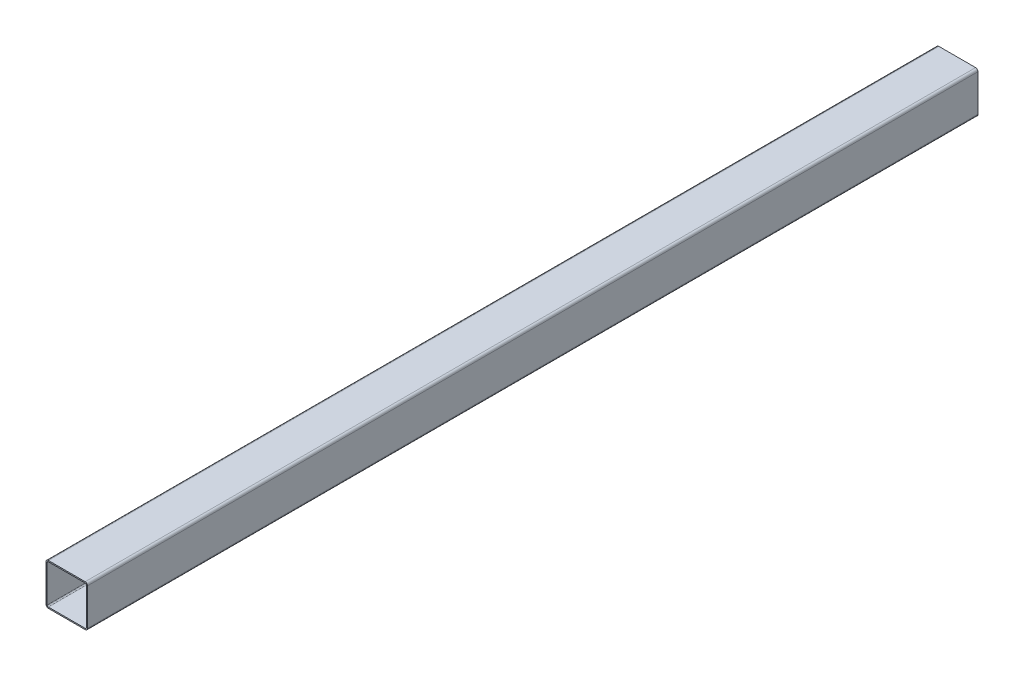
ISO-10303-21;
HEADER;
FILE_DESCRIPTION(('STEP AP214'),'2;1');
FILE_NAME('part.step','',(''),(''),'','','');
FILE_SCHEMA(('AUTOMOTIVE_DESIGN { 1 0 10303 214 1 1 1 1 }'));
ENDSEC;
DATA;
#1=APPLICATION_CONTEXT('core data for automotive mechanical design processes');
#2=APPLICATION_PROTOCOL_DEFINITION('international standard','automotive_design',2000,#1);
#3=PRODUCT_CONTEXT('',#1,'mechanical');
#4=PRODUCT('Part','Part','',(#3));
#5=PRODUCT_RELATED_PRODUCT_CATEGORY('part','',(#4));
#6=PRODUCT_DEFINITION_FORMATION('','',#4);
#7=PRODUCT_DEFINITION_CONTEXT('part definition',#1,'design');
#8=PRODUCT_DEFINITION('design','',#6,#7);
#9=PRODUCT_DEFINITION_SHAPE('','',#8);
#10=(LENGTH_UNIT() NAMED_UNIT(*) SI_UNIT(.MILLI.,.METRE.));
#11=(NAMED_UNIT(*) PLANE_ANGLE_UNIT() SI_UNIT($,.RADIAN.));
#12=(NAMED_UNIT(*) SI_UNIT($,.STERADIAN.) SOLID_ANGLE_UNIT());
#13=UNCERTAINTY_MEASURE_WITH_UNIT(LENGTH_MEASURE(1.E-05),#10,'distance_accuracy_value','');
#14=(GEOMETRIC_REPRESENTATION_CONTEXT(3) GLOBAL_UNCERTAINTY_ASSIGNED_CONTEXT((#13)) GLOBAL_UNIT_ASSIGNED_CONTEXT((#10,
#11,#12)) REPRESENTATION_CONTEXT('',''));
#15=CARTESIAN_POINT('',(0.,0.,0.));
#16=DIRECTION('',(0.,0.,1.));
#17=DIRECTION('',(1.,0.,0.));
#18=AXIS2_PLACEMENT_3D('',#15,#16,#17);
#19=CARTESIAN_POINT('',(29.0578512396694,18.7024793388417,1500.));
#20=DIRECTION('',(0.,0.,-1.));
#21=DIRECTION('',(-1.,0.,0.));
#22=AXIS2_PLACEMENT_3D('',#19,#20,#21);
#23=PLANE('',#22);
#24=CARTESIAN_POINT('',(29.0578512396694,18.7024793388417,1500.));
#25=DIRECTION('',(0.,0.,1.));
#26=DIRECTION('',(-1.,0.,0.));
#27=AXIS2_PLACEMENT_3D('',#24,#25,#26);
#28=CIRCLE('',#27,4.);
#29=CARTESIAN_POINT('',(33.0578512396694,18.7024793388417,1500.));
#30=VERTEX_POINT('',#29);
#31=CARTESIAN_POINT('',(29.0578512396694,22.7024793388422,1500.));
#32=VERTEX_POINT('',#31);
#33=EDGE_CURVE('E210',#30,#32,#28,.T.);
#34=ORIENTED_EDGE('',*,*,#33,.T.);
#35=DIRECTION('',(-1.,0.,0.));
#36=VECTOR('',#35,1.);
#37=CARTESIAN_POINT('',(29.0578512396694,22.7024793388422,1500.));
#38=LINE('',#37,#36);
#39=CARTESIAN_POINT('',(-32.9421487603306,22.7024793388422,1500.));
#40=VERTEX_POINT('',#39);
#41=EDGE_CURVE('E213',#32,#40,#38,.T.);
#42=ORIENTED_EDGE('',*,*,#41,.T.);
#43=CARTESIAN_POINT('',(-32.9421487603306,18.7024793388417,1500.));
#44=DIRECTION('',(0.,0.,1.));
#45=DIRECTION('',(-1.,0.,0.));
#46=AXIS2_PLACEMENT_3D('',#43,#44,#45);
#47=CIRCLE('',#46,4.);
#48=CARTESIAN_POINT('',(-36.9421487603306,18.7024793388417,1500.));
#49=VERTEX_POINT('',#48);
#50=EDGE_CURVE('E216',#40,#49,#47,.T.);
#51=ORIENTED_EDGE('',*,*,#50,.T.);
#52=DIRECTION('',(0.,-1.,0.));
#53=VECTOR('',#52,1.);
#54=CARTESIAN_POINT('',(-36.9421487603306,18.7024793388417,1500.));
#55=LINE('',#54,#53);
#56=CARTESIAN_POINT('',(-36.9421487603306,-43.2975206611568,1500.));
#57=VERTEX_POINT('',#56);
#58=EDGE_CURVE('E218',#49,#57,#55,.T.);
#59=ORIENTED_EDGE('',*,*,#58,.T.);
#60=CARTESIAN_POINT('',(-32.9421487603306,-43.2975206611568,1500.));
#61=DIRECTION('',(0.,0.,1.));
#62=DIRECTION('',(-1.,0.,0.));
#63=AXIS2_PLACEMENT_3D('',#60,#61,#62);
#64=CIRCLE('',#63,4.00000000000001);
#65=CARTESIAN_POINT('',(-32.9421487603306,-47.2975206611572,1500.));
#66=VERTEX_POINT('',#65);
#67=EDGE_CURVE('E220',#57,#66,#64,.T.);
#68=ORIENTED_EDGE('',*,*,#67,.T.);
#69=DIRECTION('',(1.,0.,0.));
#70=VECTOR('',#69,1.);
#71=CARTESIAN_POINT('',(29.0578512396694,-47.2975206611572,1500.));
#72=LINE('',#71,#70);
#73=CARTESIAN_POINT('',(29.0578512396694,-47.2975206611572,1500.));
#74=VERTEX_POINT('',#73);
#75=EDGE_CURVE('E222',#66,#74,#72,.T.);
#76=ORIENTED_EDGE('',*,*,#75,.T.);
#77=CARTESIAN_POINT('',(29.0578512396694,-43.2975206611568,1500.));
#78=DIRECTION('',(0.,0.,1.));
#79=DIRECTION('',(-1.,0.,0.));
#80=AXIS2_PLACEMENT_3D('',#77,#78,#79);
#81=CIRCLE('',#80,4.);
#82=CARTESIAN_POINT('',(33.0578512396694,-43.2975206611568,1500.));
#83=VERTEX_POINT('',#82);
#84=EDGE_CURVE('E224',#74,#83,#81,.T.);
#85=ORIENTED_EDGE('',*,*,#84,.T.);
#86=DIRECTION('',(0.,1.,0.));
#87=VECTOR('',#86,1.);
#88=CARTESIAN_POINT('',(33.0578512396694,18.7024793388417,1500.));
#89=LINE('',#88,#87);
#90=EDGE_CURVE('E226',#83,#30,#89,.T.);
#91=ORIENTED_EDGE('',*,*,#90,.T.);
#92=EDGE_LOOP('',(#34,#42,#51,#59,#68,#76,#85,#91));
#93=FACE_BOUND('',#92,.T.);
#94=CARTESIAN_POINT('',(29.0578512396694,18.7024793388417,1500.));
#95=DIRECTION('',(0.,0.,1.));
#96=DIRECTION('',(-1.,0.,0.));
#97=AXIS2_PLACEMENT_3D('',#94,#95,#96);
#98=CIRCLE('',#97,2.);
#99=CARTESIAN_POINT('',(31.0578512396694,18.7024793388417,1500.));
#100=VERTEX_POINT('',#99);
#101=CARTESIAN_POINT('',(29.0578512396694,20.7024793388424,1500.));
#102=VERTEX_POINT('',#101);
#103=EDGE_CURVE('E145',#100,#102,#98,.T.);
#104=ORIENTED_EDGE('',*,*,#103,.F.);
#105=DIRECTION('',(0.,1.,0.));
#106=VECTOR('',#105,1.);
#107=CARTESIAN_POINT('',(31.0578512396694,18.7024793388417,1500.));
#108=LINE('',#107,#106);
#109=CARTESIAN_POINT('',(31.0578512396694,-43.2975206611568,1500.));
#110=VERTEX_POINT('',#109);
#111=EDGE_CURVE('E178',#110,#100,#108,.T.);
#112=ORIENTED_EDGE('',*,*,#111,.F.);
#113=CARTESIAN_POINT('',(29.0578512396694,-43.2975206611568,1500.));
#114=DIRECTION('',(0.,0.,1.));
#115=DIRECTION('',(1.,0.,0.));
#116=AXIS2_PLACEMENT_3D('',#113,#114,#115);
#117=CIRCLE('',#116,2.);
#118=CARTESIAN_POINT('',(29.0578512396694,-45.2975206611566,1500.));
#119=VERTEX_POINT('',#118);
#120=EDGE_CURVE('E176',#119,#110,#117,.T.);
#121=ORIENTED_EDGE('',*,*,#120,.F.);
#122=DIRECTION('',(1.,0.,0.));
#123=VECTOR('',#122,1.);
#124=CARTESIAN_POINT('',(29.0578512396694,-45.2975206611566,1500.));
#125=LINE('',#124,#123);
#126=CARTESIAN_POINT('',(-32.9421487603306,-45.2975206611566,1500.));
#127=VERTEX_POINT('',#126);
#128=EDGE_CURVE('E174',#127,#119,#125,.T.);
#129=ORIENTED_EDGE('',*,*,#128,.F.);
#130=CARTESIAN_POINT('',(-32.9421487603306,-43.2975206611568,1500.));
#131=DIRECTION('',(0.,0.,1.));
#132=DIRECTION('',(-1.,0.,0.));
#133=AXIS2_PLACEMENT_3D('',#130,#131,#132);
#134=CIRCLE('',#133,2.);
#135=CARTESIAN_POINT('',(-34.9421487603306,-43.2975206611568,1500.));
#136=VERTEX_POINT('',#135);
#137=EDGE_CURVE('E172',#136,#127,#134,.T.);
#138=ORIENTED_EDGE('',*,*,#137,.F.);
#139=DIRECTION('',(0.,-1.,0.));
#140=VECTOR('',#139,1.);
#141=CARTESIAN_POINT('',(-34.9421487603306,18.7024793388417,1500.));
#142=LINE('',#141,#140);
#143=CARTESIAN_POINT('',(-34.9421487603306,18.7024793388417,1500.));
#144=VERTEX_POINT('',#143);
#145=EDGE_CURVE('E168',#144,#136,#142,.T.);
#146=ORIENTED_EDGE('',*,*,#145,.F.);
#147=CARTESIAN_POINT('',(-32.9421487603306,18.7024793388417,1500.));
#148=DIRECTION('',(0.,0.,1.));
#149=DIRECTION('',(-1.,0.,0.));
#150=AXIS2_PLACEMENT_3D('',#147,#148,#149);
#151=CIRCLE('',#150,2.);
#152=CARTESIAN_POINT('',(-32.9421487603306,20.7024793388424,1500.));
#153=VERTEX_POINT('',#152);
#154=EDGE_CURVE('E166',#153,#144,#151,.T.);
#155=ORIENTED_EDGE('',*,*,#154,.F.);
#156=DIRECTION('',(-1.,0.,0.));
#157=VECTOR('',#156,1.);
#158=CARTESIAN_POINT('',(29.0578512396694,20.7024793388424,1500.));
#159=LINE('',#158,#157);
#160=EDGE_CURVE('E153',#102,#153,#159,.T.);
#161=ORIENTED_EDGE('',*,*,#160,.F.);
#162=EDGE_LOOP('',(#104,#112,#121,#129,#138,#146,#155,#161));
#163=FACE_BOUND('',#162,.T.);
#164=ADVANCED_FACE('F32',(#93,#163),#23,.F.);
#165=CARTESIAN_POINT('',(29.0578512396694,18.7024793388426,0.));
#166=DIRECTION('',(0.,0.,-1.));
#167=DIRECTION('',(-1.,0.,0.));
#168=AXIS2_PLACEMENT_3D('',#165,#166,#167);
#169=PLANE('',#168);
#170=CARTESIAN_POINT('',(29.0578512396694,18.7024793388426,0.));
#171=DIRECTION('',(0.,0.,1.));
#172=DIRECTION('',(-1.,0.,0.));
#173=AXIS2_PLACEMENT_3D('',#170,#171,#172);
#174=CIRCLE('',#173,4.);
#175=CARTESIAN_POINT('',(33.0578512396694,18.7024793388426,0.));
#176=VERTEX_POINT('',#175);
#177=CARTESIAN_POINT('',(29.0578512396694,22.7024793388431,0.));
#178=VERTEX_POINT('',#177);
#179=EDGE_CURVE('E161',#176,#178,#174,.T.);
#180=ORIENTED_EDGE('',*,*,#179,.F.);
#181=DIRECTION('',(0.,1.,0.));
#182=VECTOR('',#181,1.);
#183=CARTESIAN_POINT('',(33.0578512396694,18.7024793388426,0.));
#184=LINE('',#183,#182);
#185=CARTESIAN_POINT('',(33.0578512396694,-43.2975206611586,2.22044604925031E-13));
#186=VERTEX_POINT('',#185);
#187=EDGE_CURVE('E214',#186,#176,#184,.T.);
#188=ORIENTED_EDGE('',*,*,#187,.F.);
#189=CARTESIAN_POINT('',(29.0578512396694,-43.2975206611586,2.22044604925031E-13));
#190=DIRECTION('',(0.,0.,1.));
#191=DIRECTION('',(-1.,0.,0.));
#192=AXIS2_PLACEMENT_3D('',#189,#190,#191);
#193=CIRCLE('',#192,4.);
#194=CARTESIAN_POINT('',(29.0578512396694,-47.2975206611572,0.));
#195=VERTEX_POINT('',#194);
#196=EDGE_CURVE('E241',#195,#186,#193,.T.);
#197=ORIENTED_EDGE('',*,*,#196,.F.);
#198=DIRECTION('',(1.,0.,0.));
#199=VECTOR('',#198,1.);
#200=CARTESIAN_POINT('',(29.0578512396694,-47.2975206611572,0.));
#201=LINE('',#200,#199);
#202=CARTESIAN_POINT('',(-32.9421487603306,-47.2975206611572,0.));
#203=VERTEX_POINT('',#202);
#204=EDGE_CURVE('E239',#203,#195,#201,.T.);
#205=ORIENTED_EDGE('',*,*,#204,.F.);
#206=CARTESIAN_POINT('',(-32.9421487603306,-43.2975206611586,2.22044604925031E-13));
#207=DIRECTION('',(0.,0.,1.));
#208=DIRECTION('',(-1.,0.,0.));
#209=AXIS2_PLACEMENT_3D('',#206,#207,#208);
#210=CIRCLE('',#209,4.00000000000001);
#211=CARTESIAN_POINT('',(-36.9421487603306,-43.2975206611586,2.22044604925031E-13));
#212=VERTEX_POINT('',#211);
#213=EDGE_CURVE('E237',#212,#203,#210,.T.);
#214=ORIENTED_EDGE('',*,*,#213,.F.);
#215=DIRECTION('',(0.,-1.,0.));
#216=VECTOR('',#215,1.);
#217=CARTESIAN_POINT('',(-36.9421487603306,18.7024793388426,0.));
#218=LINE('',#217,#216);
#219=CARTESIAN_POINT('',(-36.9421487603306,18.7024793388426,0.));
#220=VERTEX_POINT('',#219);
#221=EDGE_CURVE('E235',#220,#212,#218,.T.);
#222=ORIENTED_EDGE('',*,*,#221,.F.);
#223=CARTESIAN_POINT('',(-32.9421487603306,18.7024793388426,0.));
#224=DIRECTION('',(0.,0.,1.));
#225=DIRECTION('',(-1.,0.,0.));
#226=AXIS2_PLACEMENT_3D('',#223,#224,#225);
#227=CIRCLE('',#226,4.);
#228=CARTESIAN_POINT('',(-32.9421487603306,22.7024793388431,0.));
#229=VERTEX_POINT('',#228);
#230=EDGE_CURVE('E233',#229,#220,#227,.T.);
#231=ORIENTED_EDGE('',*,*,#230,.F.);
#232=DIRECTION('',(-1.,0.,0.));
#233=VECTOR('',#232,1.);
#234=CARTESIAN_POINT('',(29.0578512396694,22.7024793388431,0.));
#235=LINE('',#234,#233);
#236=EDGE_CURVE('E231',#178,#229,#235,.T.);
#237=ORIENTED_EDGE('',*,*,#236,.F.);
#238=EDGE_LOOP('',(#180,#188,#197,#205,#214,#222,#231,#237));
#239=FACE_BOUND('',#238,.T.);
#240=DIRECTION('',(0.,1.,0.));
#241=VECTOR('',#240,1.);
#242=CARTESIAN_POINT('',(31.0578512396694,18.7024793388426,0.));
#243=LINE('',#242,#241);
#244=CARTESIAN_POINT('',(31.0578512396694,-43.2975206611586,2.22044604925031E-13));
#245=VERTEX_POINT('',#244);
#246=CARTESIAN_POINT('',(31.0578512396694,18.7024793388426,0.));
#247=VERTEX_POINT('',#246);
#248=EDGE_CURVE('E154',#245,#247,#243,.T.);
#249=ORIENTED_EDGE('',*,*,#248,.T.);
#250=CARTESIAN_POINT('',(29.0578512396694,18.7024793388426,0.));
#251=DIRECTION('',(0.,0.,1.));
#252=DIRECTION('',(-1.,0.,0.));
#253=AXIS2_PLACEMENT_3D('',#250,#251,#252);
#254=CIRCLE('',#253,2.);
#255=CARTESIAN_POINT('',(29.0578512396694,20.7024793388424,2.22044604925031E-13));
#256=VERTEX_POINT('',#255);
#257=EDGE_CURVE('E55',#247,#256,#254,.T.);
#258=ORIENTED_EDGE('',*,*,#257,.T.);
#259=DIRECTION('',(-1.,0.,0.));
#260=VECTOR('',#259,1.);
#261=CARTESIAN_POINT('',(29.0578512396694,20.7024793388424,2.22044604925031E-13));
#262=LINE('',#261,#260);
#263=CARTESIAN_POINT('',(-32.9421487603306,20.7024793388424,2.22044604925031E-13));
#264=VERTEX_POINT('',#263);
#265=EDGE_CURVE('E160',#256,#264,#262,.T.);
#266=ORIENTED_EDGE('',*,*,#265,.T.);
#267=CARTESIAN_POINT('',(-32.9421487603306,18.7024793388426,0.));
#268=DIRECTION('',(0.,0.,1.));
#269=DIRECTION('',(-1.,0.,0.));
#270=AXIS2_PLACEMENT_3D('',#267,#268,#269);
#271=CIRCLE('',#270,2.);
#272=CARTESIAN_POINT('',(-34.9421487603306,18.7024793388426,0.));
#273=VERTEX_POINT('',#272);
#274=EDGE_CURVE('E182',#264,#273,#271,.T.);
#275=ORIENTED_EDGE('',*,*,#274,.T.);
#276=DIRECTION('',(0.,-1.,0.));
#277=VECTOR('',#276,1.);
#278=CARTESIAN_POINT('',(-34.9421487603306,18.7024793388426,0.));
#279=LINE('',#278,#277);
#280=CARTESIAN_POINT('',(-34.9421487603306,-43.2975206611586,2.22044604925031E-13));
#281=VERTEX_POINT('',#280);
#282=EDGE_CURVE('E185',#273,#281,#279,.T.);
#283=ORIENTED_EDGE('',*,*,#282,.T.);
#284=CARTESIAN_POINT('',(-32.9421487603306,-43.2975206611586,2.22044604925031E-13));
#285=DIRECTION('',(0.,0.,1.));
#286=DIRECTION('',(-1.,0.,0.));
#287=AXIS2_PLACEMENT_3D('',#284,#285,#286);
#288=CIRCLE('',#287,2.);
#289=CARTESIAN_POINT('',(-32.9421487603306,-45.2975206611566,0.));
#290=VERTEX_POINT('',#289);
#291=EDGE_CURVE('E188',#281,#290,#288,.T.);
#292=ORIENTED_EDGE('',*,*,#291,.T.);
#293=DIRECTION('',(1.,0.,0.));
#294=VECTOR('',#293,1.);
#295=CARTESIAN_POINT('',(29.0578512396694,-45.2975206611566,0.));
#296=LINE('',#295,#294);
#297=CARTESIAN_POINT('',(29.0578512396694,-45.2975206611566,0.));
#298=VERTEX_POINT('',#297);
#299=EDGE_CURVE('E191',#290,#298,#296,.T.);
#300=ORIENTED_EDGE('',*,*,#299,.T.);
#301=CARTESIAN_POINT('',(29.0578512396694,-43.2975206611586,2.22044604925031E-13));
#302=DIRECTION('',(0.,0.,1.));
#303=DIRECTION('',(1.,0.,0.));
#304=AXIS2_PLACEMENT_3D('',#301,#302,#303);
#305=CIRCLE('',#304,2.);
#306=EDGE_CURVE('E194',#298,#245,#305,.T.);
#307=ORIENTED_EDGE('',*,*,#306,.T.);
#308=EDGE_LOOP('',(#249,#258,#266,#275,#283,#292,#300,#307));
#309=FACE_BOUND('',#308,.T.);
#310=ADVANCED_FACE('F271',(#239,#309),#169,.T.);
#311=CARTESIAN_POINT('',(29.0578512396694,18.7024793388417,1500.));
#312=DIRECTION('',(0.,0.,-1.));
#313=DIRECTION('',(-1.,0.,0.));
#314=AXIS2_PLACEMENT_3D('',#311,#312,#313);
#315=CYLINDRICAL_SURFACE('',#314,4.);
#316=ORIENTED_EDGE('',*,*,#179,.T.);
#317=DIRECTION('',(0.,0.,-1.));
#318=VECTOR('',#317,1.);
#319=CARTESIAN_POINT('',(29.0578512396694,22.7024793388422,1500.));
#320=LINE('',#319,#318);
#321=EDGE_CURVE('E11',#32,#178,#320,.T.);
#322=ORIENTED_EDGE('',*,*,#321,.F.);
#323=ORIENTED_EDGE('',*,*,#33,.F.);
#324=DIRECTION('',(0.,0.,-1.));
#325=VECTOR('',#324,1.);
#326=CARTESIAN_POINT('',(33.0578512396694,18.7024793388417,1500.));
#327=LINE('',#326,#325);
#328=EDGE_CURVE('E228',#30,#176,#327,.T.);
#329=ORIENTED_EDGE('',*,*,#328,.T.);
#330=EDGE_LOOP('',(#316,#322,#323,#329));
#331=FACE_BOUND('',#330,.T.);
#332=ADVANCED_FACE('F34',(#331),#315,.T.);
#333=CARTESIAN_POINT('',(29.0578512396694,22.7024793388422,1500.));
#334=DIRECTION('',(0.,-1.,0.));
#335=DIRECTION('',(1.,0.,0.));
#336=AXIS2_PLACEMENT_3D('',#333,#334,#335);
#337=PLANE('',#336);
#338=ORIENTED_EDGE('',*,*,#236,.T.);
#339=DIRECTION('',(0.,0.,-1.));
#340=VECTOR('',#339,1.);
#341=CARTESIAN_POINT('',(-32.9421487603306,22.7024793388422,1500.));
#342=LINE('',#341,#340);
#343=EDGE_CURVE('E40',#40,#229,#342,.T.);
#344=ORIENTED_EDGE('',*,*,#343,.F.);
#345=ORIENTED_EDGE('',*,*,#41,.F.);
#346=ORIENTED_EDGE('',*,*,#321,.T.);
#347=EDGE_LOOP('',(#338,#344,#345,#346));
#348=FACE_BOUND('',#347,.T.);
#349=ADVANCED_FACE('F288',(#348),#337,.F.);
#350=CARTESIAN_POINT('',(-32.9421487603306,18.7024793388417,1500.));
#351=DIRECTION('',(0.,0.,-1.));
#352=DIRECTION('',(-1.,0.,0.));
#353=AXIS2_PLACEMENT_3D('',#350,#351,#352);
#354=CYLINDRICAL_SURFACE('',#353,4.);
#355=ORIENTED_EDGE('',*,*,#230,.T.);
#356=DIRECTION('',(0.,0.,-1.));
#357=VECTOR('',#356,1.);
#358=CARTESIAN_POINT('',(-36.9421487603306,18.7024793388417,1500.));
#359=LINE('',#358,#357);
#360=EDGE_CURVE('E258',#49,#220,#359,.T.);
#361=ORIENTED_EDGE('',*,*,#360,.F.);
#362=ORIENTED_EDGE('',*,*,#50,.F.);
#363=ORIENTED_EDGE('',*,*,#343,.T.);
#364=EDGE_LOOP('',(#355,#361,#362,#363));
#365=FACE_BOUND('',#364,.T.);
#366=ADVANCED_FACE('F265',(#365),#354,.T.);
#367=CARTESIAN_POINT('',(-36.9421487603306,18.7024793388417,1500.));
#368=DIRECTION('',(1.,0.,0.));
#369=DIRECTION('',(0.,0.,-1.));
#370=AXIS2_PLACEMENT_3D('',#367,#368,#369);
#371=PLANE('',#370);
#372=ORIENTED_EDGE('',*,*,#221,.T.);
#373=DIRECTION('',(0.,0.,-1.));
#374=VECTOR('',#373,1.);
#375=CARTESIAN_POINT('',(-36.9421487603306,-43.2975206611568,1500.));
#376=LINE('',#375,#374);
#377=EDGE_CURVE('E255',#57,#212,#376,.T.);
#378=ORIENTED_EDGE('',*,*,#377,.F.);
#379=ORIENTED_EDGE('',*,*,#58,.F.);
#380=ORIENTED_EDGE('',*,*,#360,.T.);
#381=EDGE_LOOP('',(#372,#378,#379,#380));
#382=FACE_BOUND('',#381,.T.);
#383=ADVANCED_FACE('F277',(#382),#371,.F.);
#384=CARTESIAN_POINT('',(-32.9421487603306,-43.2975206611568,1500.));
#385=DIRECTION('',(0.,0.,-1.));
#386=DIRECTION('',(-1.,0.,0.));
#387=AXIS2_PLACEMENT_3D('',#384,#385,#386);
#388=CYLINDRICAL_SURFACE('',#387,4.00000000000001);
#389=ORIENTED_EDGE('',*,*,#213,.T.);
#390=DIRECTION('',(0.,0.,-1.));
#391=VECTOR('',#390,1.);
#392=CARTESIAN_POINT('',(-32.9421487603306,-47.2975206611572,1500.));
#393=LINE('',#392,#391);
#394=EDGE_CURVE('E252',#66,#203,#393,.T.);
#395=ORIENTED_EDGE('',*,*,#394,.F.);
#396=ORIENTED_EDGE('',*,*,#67,.F.);
#397=ORIENTED_EDGE('',*,*,#377,.T.);
#398=EDGE_LOOP('',(#389,#395,#396,#397));
#399=FACE_BOUND('',#398,.T.);
#400=ADVANCED_FACE('F281',(#399),#388,.T.);
#401=CARTESIAN_POINT('',(29.0578512396694,-47.2975206611572,1500.));
#402=DIRECTION('',(0.,1.,0.));
#403=DIRECTION('',(-1.,0.,0.));
#404=AXIS2_PLACEMENT_3D('',#401,#402,#403);
#405=PLANE('',#404);
#406=ORIENTED_EDGE('',*,*,#204,.T.);
#407=DIRECTION('',(0.,0.,-1.));
#408=VECTOR('',#407,1.);
#409=CARTESIAN_POINT('',(29.0578512396694,-47.2975206611572,1500.));
#410=LINE('',#409,#408);
#411=EDGE_CURVE('E249',#74,#195,#410,.T.);
#412=ORIENTED_EDGE('',*,*,#411,.F.);
#413=ORIENTED_EDGE('',*,*,#75,.F.);
#414=ORIENTED_EDGE('',*,*,#394,.T.);
#415=EDGE_LOOP('',(#406,#412,#413,#414));
#416=FACE_BOUND('',#415,.T.);
#417=ADVANCED_FACE('F301',(#416),#405,.F.);
#418=CARTESIAN_POINT('',(29.0578512396694,-43.2975206611568,1500.));
#419=DIRECTION('',(0.,0.,-1.));
#420=DIRECTION('',(-1.,0.,0.));
#421=AXIS2_PLACEMENT_3D('',#418,#419,#420);
#422=CYLINDRICAL_SURFACE('',#421,4.);
#423=ORIENTED_EDGE('',*,*,#196,.T.);
#424=DIRECTION('',(0.,0.,-1.));
#425=VECTOR('',#424,1.);
#426=CARTESIAN_POINT('',(33.0578512396694,-43.2975206611568,1500.));
#427=LINE('',#426,#425);
#428=EDGE_CURVE('E246',#83,#186,#427,.T.);
#429=ORIENTED_EDGE('',*,*,#428,.F.);
#430=ORIENTED_EDGE('',*,*,#84,.F.);
#431=ORIENTED_EDGE('',*,*,#411,.T.);
#432=EDGE_LOOP('',(#423,#429,#430,#431));
#433=FACE_BOUND('',#432,.T.);
#434=ADVANCED_FACE('F299',(#433),#422,.T.);
#435=CARTESIAN_POINT('',(33.0578512396694,18.7024793388417,1500.));
#436=DIRECTION('',(-1.,0.,0.));
#437=DIRECTION('',(0.,-1.,0.));
#438=AXIS2_PLACEMENT_3D('',#435,#436,#437);
#439=PLANE('',#438);
#440=ORIENTED_EDGE('',*,*,#187,.T.);
#441=ORIENTED_EDGE('',*,*,#328,.F.);
#442=ORIENTED_EDGE('',*,*,#90,.F.);
#443=ORIENTED_EDGE('',*,*,#428,.T.);
#444=EDGE_LOOP('',(#440,#441,#442,#443));
#445=FACE_BOUND('',#444,.T.);
#446=ADVANCED_FACE('F294',(#445),#439,.F.);
#447=CARTESIAN_POINT('',(29.0578512396694,18.7024793388417,1500.));
#448=DIRECTION('',(0.,0.,-1.));
#449=DIRECTION('',(-1.,0.,0.));
#450=AXIS2_PLACEMENT_3D('',#447,#448,#449);
#451=CYLINDRICAL_SURFACE('',#450,2.);
#452=ORIENTED_EDGE('',*,*,#257,.F.);
#453=DIRECTION('',(0.,0.,-1.));
#454=VECTOR('',#453,1.);
#455=CARTESIAN_POINT('',(31.0578512396694,18.7024793388417,1500.));
#456=LINE('',#455,#454);
#457=EDGE_CURVE('E149',#100,#247,#456,.T.);
#458=ORIENTED_EDGE('',*,*,#457,.F.);
#459=ORIENTED_EDGE('',*,*,#103,.T.);
#460=DIRECTION('',(0.,0.,-1.));
#461=VECTOR('',#460,1.);
#462=CARTESIAN_POINT('',(29.0578512396694,20.7024793388424,1500.));
#463=LINE('',#462,#461);
#464=EDGE_CURVE('E148',#102,#256,#463,.T.);
#465=ORIENTED_EDGE('',*,*,#464,.T.);
#466=EDGE_LOOP('',(#452,#458,#459,#465));
#467=FACE_BOUND('',#466,.T.);
#468=ADVANCED_FACE('F147',(#467),#451,.F.);
#469=CARTESIAN_POINT('',(29.0578512396694,20.7024793388424,1500.));
#470=DIRECTION('',(0.,-1.,0.));
#471=DIRECTION('',(1.,0.,0.));
#472=AXIS2_PLACEMENT_3D('',#469,#470,#471);
#473=PLANE('',#472);
#474=ORIENTED_EDGE('',*,*,#265,.F.);
#475=ORIENTED_EDGE('',*,*,#464,.F.);
#476=ORIENTED_EDGE('',*,*,#160,.T.);
#477=DIRECTION('',(0.,0.,-1.));
#478=VECTOR('',#477,1.);
#479=CARTESIAN_POINT('',(-32.9421487603306,20.7024793388424,1500.));
#480=LINE('',#479,#478);
#481=EDGE_CURVE('E162',#153,#264,#480,.T.);
#482=ORIENTED_EDGE('',*,*,#481,.T.);
#483=EDGE_LOOP('',(#474,#475,#476,#482));
#484=FACE_BOUND('',#483,.T.);
#485=ADVANCED_FACE('F157',(#484),#473,.T.);
#486=CARTESIAN_POINT('',(-32.9421487603306,18.7024793388417,1500.));
#487=DIRECTION('',(0.,0.,-1.));
#488=DIRECTION('',(-1.,0.,0.));
#489=AXIS2_PLACEMENT_3D('',#486,#487,#488);
#490=CYLINDRICAL_SURFACE('',#489,2.);
#491=ORIENTED_EDGE('',*,*,#274,.F.);
#492=ORIENTED_EDGE('',*,*,#481,.F.);
#493=ORIENTED_EDGE('',*,*,#154,.T.);
#494=DIRECTION('',(0.,0.,-1.));
#495=VECTOR('',#494,1.);
#496=CARTESIAN_POINT('',(-34.9421487603306,18.7024793388417,1500.));
#497=LINE('',#496,#495);
#498=EDGE_CURVE('E207',#144,#273,#497,.T.);
#499=ORIENTED_EDGE('',*,*,#498,.T.);
#500=EDGE_LOOP('',(#491,#492,#493,#499));
#501=FACE_BOUND('',#500,.T.);
#502=ADVANCED_FACE('F326',(#501),#490,.F.);
#503=CARTESIAN_POINT('',(-34.9421487603306,18.7024793388417,1500.));
#504=DIRECTION('',(1.,0.,0.));
#505=DIRECTION('',(0.,0.,-1.));
#506=AXIS2_PLACEMENT_3D('',#503,#504,#505);
#507=PLANE('',#506);
#508=ORIENTED_EDGE('',*,*,#282,.F.);
#509=ORIENTED_EDGE('',*,*,#498,.F.);
#510=ORIENTED_EDGE('',*,*,#145,.T.);
#511=DIRECTION('',(0.,0.,-1.));
#512=VECTOR('',#511,1.);
#513=CARTESIAN_POINT('',(-34.9421487603306,-43.2975206611568,1500.));
#514=LINE('',#513,#512);
#515=EDGE_CURVE('E205',#136,#281,#514,.T.);
#516=ORIENTED_EDGE('',*,*,#515,.T.);
#517=EDGE_LOOP('',(#508,#509,#510,#516));
#518=FACE_BOUND('',#517,.T.);
#519=ADVANCED_FACE('F330',(#518),#507,.T.);
#520=CARTESIAN_POINT('',(-32.9421487603306,-43.2975206611568,1500.));
#521=DIRECTION('',(0.,0.,-1.));
#522=DIRECTION('',(-1.,0.,0.));
#523=AXIS2_PLACEMENT_3D('',#520,#521,#522);
#524=CYLINDRICAL_SURFACE('',#523,2.);
#525=ORIENTED_EDGE('',*,*,#291,.F.);
#526=ORIENTED_EDGE('',*,*,#515,.F.);
#527=ORIENTED_EDGE('',*,*,#137,.T.);
#528=DIRECTION('',(0.,0.,-1.));
#529=VECTOR('',#528,1.);
#530=CARTESIAN_POINT('',(-32.9421487603306,-45.2975206611566,1500.));
#531=LINE('',#530,#529);
#532=EDGE_CURVE('E203',#127,#290,#531,.T.);
#533=ORIENTED_EDGE('',*,*,#532,.T.);
#534=EDGE_LOOP('',(#525,#526,#527,#533));
#535=FACE_BOUND('',#534,.T.);
#536=ADVANCED_FACE('F336',(#535),#524,.F.);
#537=CARTESIAN_POINT('',(29.0578512396694,-45.2975206611566,1500.));
#538=DIRECTION('',(0.,1.,0.));
#539=DIRECTION('',(0.,0.,1.));
#540=AXIS2_PLACEMENT_3D('',#537,#538,#539);
#541=PLANE('',#540);
#542=ORIENTED_EDGE('',*,*,#299,.F.);
#543=ORIENTED_EDGE('',*,*,#532,.F.);
#544=ORIENTED_EDGE('',*,*,#128,.T.);
#545=DIRECTION('',(0.,0.,-1.));
#546=VECTOR('',#545,1.);
#547=CARTESIAN_POINT('',(29.0578512396694,-45.2975206611566,1500.));
#548=LINE('',#547,#546);
#549=EDGE_CURVE('E201',#119,#298,#548,.T.);
#550=ORIENTED_EDGE('',*,*,#549,.T.);
#551=EDGE_LOOP('',(#542,#543,#544,#550));
#552=FACE_BOUND('',#551,.T.);
#553=ADVANCED_FACE('F340',(#552),#541,.T.);
#554=CARTESIAN_POINT('',(29.0578512396694,-43.2975206611568,1500.));
#555=DIRECTION('',(0.,0.,-1.));
#556=DIRECTION('',(-1.,0.,0.));
#557=AXIS2_PLACEMENT_3D('',#554,#555,#556);
#558=CYLINDRICAL_SURFACE('',#557,2.);
#559=ORIENTED_EDGE('',*,*,#306,.F.);
#560=ORIENTED_EDGE('',*,*,#549,.F.);
#561=ORIENTED_EDGE('',*,*,#120,.T.);
#562=DIRECTION('',(0.,0.,-1.));
#563=VECTOR('',#562,1.);
#564=CARTESIAN_POINT('',(31.0578512396694,-43.2975206611568,1500.));
#565=LINE('',#564,#563);
#566=EDGE_CURVE('E47',#110,#245,#565,.T.);
#567=ORIENTED_EDGE('',*,*,#566,.T.);
#568=EDGE_LOOP('',(#559,#560,#561,#567));
#569=FACE_BOUND('',#568,.T.);
#570=ADVANCED_FACE('F344',(#569),#558,.F.);
#571=CARTESIAN_POINT('',(31.0578512396694,18.7024793388417,1500.));
#572=DIRECTION('',(-1.,0.,0.));
#573=DIRECTION('',(0.,-1.,0.));
#574=AXIS2_PLACEMENT_3D('',#571,#572,#573);
#575=PLANE('',#574);
#576=ORIENTED_EDGE('',*,*,#248,.F.);
#577=ORIENTED_EDGE('',*,*,#566,.F.);
#578=ORIENTED_EDGE('',*,*,#111,.T.);
#579=ORIENTED_EDGE('',*,*,#457,.T.);
#580=EDGE_LOOP('',(#576,#577,#578,#579));
#581=FACE_BOUND('',#580,.T.);
#582=ADVANCED_FACE('F348',(#581),#575,.T.);
#583=CLOSED_SHELL('',(#164,#310,#332,#349,#366,#383,#400,#417,#434,#446,#468,#485,#502,#519,
#536,#553,#570,#582));
#584=MANIFOLD_SOLID_BREP('B2',#583);
#585=ADVANCED_BREP_SHAPE_REPRESENTATION('',(#18,#584),#14);
#586=SHAPE_DEFINITION_REPRESENTATION(#9,#585);
ENDSEC;
END-ISO-10303-21;
